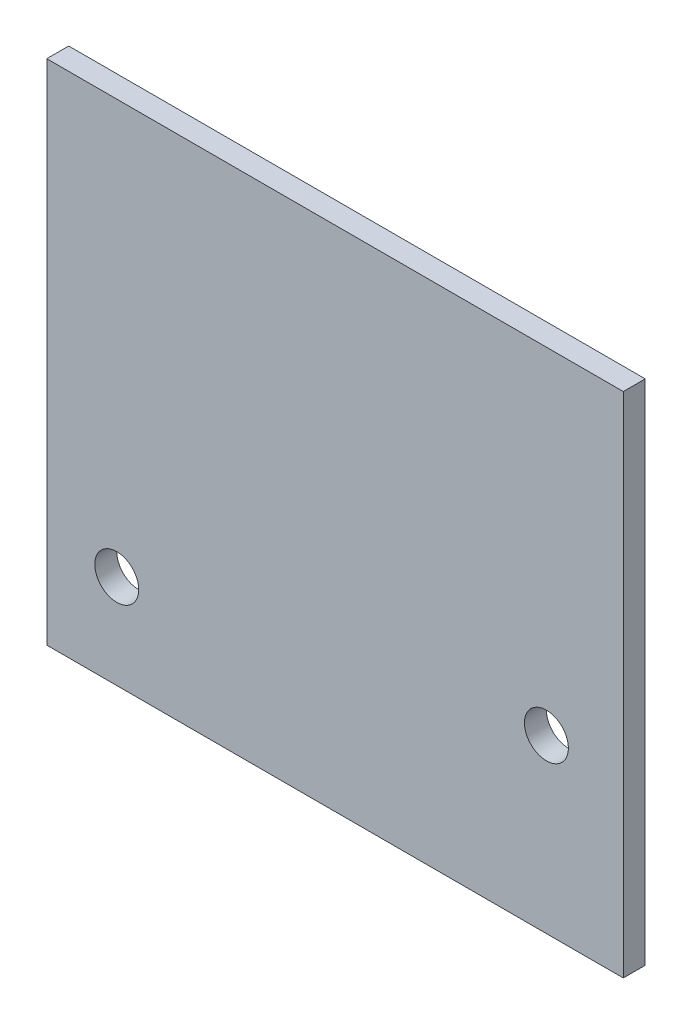
ISO-10303-21;
HEADER;
FILE_DESCRIPTION(('STEP AP214'),'2;1');
FILE_NAME('part.step','',(''),(''),'','','');
FILE_SCHEMA(('AUTOMOTIVE_DESIGN { 1 0 10303 214 1 1 1 1 }'));
ENDSEC;
DATA;
#1=APPLICATION_CONTEXT('core data for automotive mechanical design processes');
#2=APPLICATION_PROTOCOL_DEFINITION('international standard','automotive_design',2000,#1);
#3=PRODUCT_CONTEXT('',#1,'mechanical');
#4=PRODUCT('Part','Part','',(#3));
#5=PRODUCT_RELATED_PRODUCT_CATEGORY('part','',(#4));
#6=PRODUCT_DEFINITION_FORMATION('','',#4);
#7=PRODUCT_DEFINITION_CONTEXT('part definition',#1,'design');
#8=PRODUCT_DEFINITION('design','',#6,#7);
#9=PRODUCT_DEFINITION_SHAPE('','',#8);
#10=(LENGTH_UNIT() NAMED_UNIT(*) SI_UNIT(.MILLI.,.METRE.));
#11=(NAMED_UNIT(*) PLANE_ANGLE_UNIT() SI_UNIT($,.RADIAN.));
#12=(NAMED_UNIT(*) SI_UNIT($,.STERADIAN.) SOLID_ANGLE_UNIT());
#13=UNCERTAINTY_MEASURE_WITH_UNIT(LENGTH_MEASURE(1.E-05),#10,'distance_accuracy_value','');
#14=(GEOMETRIC_REPRESENTATION_CONTEXT(3) GLOBAL_UNCERTAINTY_ASSIGNED_CONTEXT((#13)) GLOBAL_UNIT_ASSIGNED_CONTEXT((#10,
#11,#12)) REPRESENTATION_CONTEXT('',''));
#15=CARTESIAN_POINT('',(0.,0.,0.));
#16=DIRECTION('',(0.,0.,1.));
#17=DIRECTION('',(1.,0.,0.));
#18=AXIS2_PLACEMENT_3D('',#15,#16,#17);
#19=CARTESIAN_POINT('',(0.,0.,1.6));
#20=DIRECTION('',(0.,0.,1.));
#21=DIRECTION('',(1.,0.,0.));
#22=AXIS2_PLACEMENT_3D('',#19,#20,#21);
#23=PLANE('',#22);
#24=CARTESIAN_POINT('',(15.4,-6.,1.6));
#25=DIRECTION('',(0.,0.,-1.));
#26=DIRECTION('',(-1.,0.,0.));
#27=AXIS2_PLACEMENT_3D('',#24,#25,#26);
#28=CIRCLE('',#27,1.6);
#29=CARTESIAN_POINT('',(13.8,-6.,1.6));
#30=VERTEX_POINT('',#29);
#31=EDGE_CURVE('E86',#30,#30,#28,.T.);
#32=ORIENTED_EDGE('',*,*,#31,.T.);
#33=EDGE_LOOP('',(#32));
#34=FACE_BOUND('',#33,.T.);
#35=CARTESIAN_POINT('',(-15.9,-11.65,1.6));
#36=DIRECTION('',(0.,0.,-1.));
#37=DIRECTION('',(-1.,0.,0.));
#38=AXIS2_PLACEMENT_3D('',#35,#36,#37);
#39=CIRCLE('',#38,1.60000000000001);
#40=CARTESIAN_POINT('',(-17.5,-11.65,1.6));
#41=VERTEX_POINT('',#40);
#42=EDGE_CURVE('E21',#41,#41,#39,.T.);
#43=ORIENTED_EDGE('',*,*,#42,.T.);
#44=EDGE_LOOP('',(#43));
#45=FACE_BOUND('',#44,.T.);
#46=DIRECTION('',(0.,1.,0.));
#47=VECTOR('',#46,1.);
#48=CARTESIAN_POINT('',(-21.,-18.5,1.6));
#49=LINE('',#48,#47);
#50=CARTESIAN_POINT('',(-21.,-18.5,1.6));
#51=VERTEX_POINT('',#50);
#52=CARTESIAN_POINT('',(-21.,18.5,1.6));
#53=VERTEX_POINT('',#52);
#54=EDGE_CURVE('E69',#51,#53,#49,.T.);
#55=ORIENTED_EDGE('',*,*,#54,.F.);
#56=DIRECTION('',(1.,0.,0.));
#57=VECTOR('',#56,1.);
#58=CARTESIAN_POINT('',(21.,-18.5,1.6));
#59=LINE('',#58,#57);
#60=CARTESIAN_POINT('',(21.,-18.5,1.6));
#61=VERTEX_POINT('',#60);
#62=EDGE_CURVE('E60',#61,#51,#59,.F.);
#63=ORIENTED_EDGE('',*,*,#62,.F.);
#64=DIRECTION('',(0.,1.,0.));
#65=VECTOR('',#64,1.);
#66=CARTESIAN_POINT('',(21.,18.5,1.6));
#67=LINE('',#66,#65);
#68=CARTESIAN_POINT('',(21.,18.5,1.6));
#69=VERTEX_POINT('',#68);
#70=EDGE_CURVE('E55',#69,#61,#67,.F.);
#71=ORIENTED_EDGE('',*,*,#70,.F.);
#72=DIRECTION('',(1.,0.,0.));
#73=VECTOR('',#72,1.);
#74=CARTESIAN_POINT('',(-21.,18.5,1.6));
#75=LINE('',#74,#73);
#76=EDGE_CURVE('E72',#53,#69,#75,.T.);
#77=ORIENTED_EDGE('',*,*,#76,.F.);
#78=EDGE_LOOP('',(#55,#63,#71,#77));
#79=FACE_BOUND('',#78,.T.);
#80=ADVANCED_FACE('F17',(#34,#45,#79),#23,.T.);
#81=CARTESIAN_POINT('',(-21.,-18.5,0.));
#82=DIRECTION('',(-1.,0.,0.));
#83=DIRECTION('',(0.,0.,1.));
#84=AXIS2_PLACEMENT_3D('',#81,#82,#83);
#85=PLANE('',#84);
#86=DIRECTION('',(0.,1.,0.));
#87=VECTOR('',#86,1.);
#88=CARTESIAN_POINT('',(-21.,0.,0.));
#89=LINE('',#88,#87);
#90=CARTESIAN_POINT('',(-21.,18.5,0.));
#91=VERTEX_POINT('',#90);
#92=CARTESIAN_POINT('',(-21.,-18.5,0.));
#93=VERTEX_POINT('',#92);
#94=EDGE_CURVE('E79',#91,#93,#89,.F.);
#95=ORIENTED_EDGE('',*,*,#94,.T.);
#96=DIRECTION('',(0.,0.,-1.));
#97=VECTOR('',#96,1.);
#98=CARTESIAN_POINT('',(-21.,-18.5,0.));
#99=LINE('',#98,#97);
#100=EDGE_CURVE('E65',#51,#93,#99,.T.);
#101=ORIENTED_EDGE('',*,*,#100,.F.);
#102=ORIENTED_EDGE('',*,*,#54,.T.);
#103=DIRECTION('',(0.,0.,1.));
#104=VECTOR('',#103,1.);
#105=CARTESIAN_POINT('',(-21.,18.5,0.));
#106=LINE('',#105,#104);
#107=EDGE_CURVE('E93',#91,#53,#106,.T.);
#108=ORIENTED_EDGE('',*,*,#107,.F.);
#109=EDGE_LOOP('',(#95,#101,#102,#108));
#110=FACE_BOUND('',#109,.T.);
#111=ADVANCED_FACE('F78',(#110),#85,.T.);
#112=CARTESIAN_POINT('',(21.,-18.5,0.));
#113=DIRECTION('',(0.,-1.,0.));
#114=DIRECTION('',(0.,0.,-1.));
#115=AXIS2_PLACEMENT_3D('',#112,#113,#114);
#116=PLANE('',#115);
#117=DIRECTION('',(1.,0.,0.));
#118=VECTOR('',#117,1.);
#119=CARTESIAN_POINT('',(0.,-18.5,0.));
#120=LINE('',#119,#118);
#121=CARTESIAN_POINT('',(21.,-18.5,0.));
#122=VERTEX_POINT('',#121);
#123=EDGE_CURVE('E90',#93,#122,#120,.T.);
#124=ORIENTED_EDGE('',*,*,#123,.T.);
#125=DIRECTION('',(0.,0.,-1.));
#126=VECTOR('',#125,1.);
#127=CARTESIAN_POINT('',(21.,-18.5,0.));
#128=LINE('',#127,#126);
#129=EDGE_CURVE('E67',#61,#122,#128,.T.);
#130=ORIENTED_EDGE('',*,*,#129,.F.);
#131=ORIENTED_EDGE('',*,*,#62,.T.);
#132=ORIENTED_EDGE('',*,*,#100,.T.);
#133=EDGE_LOOP('',(#124,#130,#131,#132));
#134=FACE_BOUND('',#133,.T.);
#135=ADVANCED_FACE('F63',(#134),#116,.T.);
#136=CARTESIAN_POINT('',(21.,18.5,0.));
#137=DIRECTION('',(1.,0.,0.));
#138=DIRECTION('',(0.,0.,-1.));
#139=AXIS2_PLACEMENT_3D('',#136,#137,#138);
#140=PLANE('',#139);
#141=DIRECTION('',(0.,1.,0.));
#142=VECTOR('',#141,1.);
#143=CARTESIAN_POINT('',(21.,0.,0.));
#144=LINE('',#143,#142);
#145=CARTESIAN_POINT('',(21.,18.5,0.));
#146=VERTEX_POINT('',#145);
#147=EDGE_CURVE('E103',#122,#146,#144,.T.);
#148=ORIENTED_EDGE('',*,*,#147,.T.);
#149=DIRECTION('',(0.,0.,1.));
#150=VECTOR('',#149,1.);
#151=CARTESIAN_POINT('',(21.,18.5,0.));
#152=LINE('',#151,#150);
#153=EDGE_CURVE('E36',#69,#146,#152,.F.);
#154=ORIENTED_EDGE('',*,*,#153,.F.);
#155=ORIENTED_EDGE('',*,*,#70,.T.);
#156=ORIENTED_EDGE('',*,*,#129,.T.);
#157=EDGE_LOOP('',(#148,#154,#155,#156));
#158=FACE_BOUND('',#157,.T.);
#159=ADVANCED_FACE('F102',(#158),#140,.T.);
#160=CARTESIAN_POINT('',(-21.,18.5,0.));
#161=DIRECTION('',(0.,1.,0.));
#162=DIRECTION('',(0.,0.,1.));
#163=AXIS2_PLACEMENT_3D('',#160,#161,#162);
#164=PLANE('',#163);
#165=DIRECTION('',(1.,0.,0.));
#166=VECTOR('',#165,1.);
#167=CARTESIAN_POINT('',(0.,18.5,0.));
#168=LINE('',#167,#166);
#169=EDGE_CURVE('E85',#146,#91,#168,.F.);
#170=ORIENTED_EDGE('',*,*,#169,.T.);
#171=ORIENTED_EDGE('',*,*,#107,.T.);
#172=ORIENTED_EDGE('',*,*,#76,.T.);
#173=ORIENTED_EDGE('',*,*,#153,.T.);
#174=EDGE_LOOP('',(#170,#171,#172,#173));
#175=FACE_BOUND('',#174,.T.);
#176=ADVANCED_FACE('F108',(#175),#164,.T.);
#177=CARTESIAN_POINT('',(-15.9,-11.65,1.59999999999999));
#178=DIRECTION('',(0.,0.,-1.));
#179=DIRECTION('',(-1.,0.,0.));
#180=AXIS2_PLACEMENT_3D('',#177,#178,#179);
#181=CYLINDRICAL_SURFACE('',#180,1.60000000000001);
#182=CARTESIAN_POINT('',(-15.9,-11.65,0.));
#183=DIRECTION('',(0.,0.,-1.));
#184=DIRECTION('',(-1.,0.,0.));
#185=AXIS2_PLACEMENT_3D('',#182,#183,#184);
#186=CIRCLE('',#185,1.60000000000001);
#187=CARTESIAN_POINT('',(-17.5,-11.65,0.));
#188=VERTEX_POINT('',#187);
#189=EDGE_CURVE('E27',#188,#188,#186,.T.);
#190=ORIENTED_EDGE('',*,*,#189,.T.);
#191=EDGE_LOOP('',(#190));
#192=FACE_BOUND('',#191,.T.);
#193=ORIENTED_EDGE('',*,*,#42,.F.);
#194=EDGE_LOOP('',(#193));
#195=FACE_BOUND('',#194,.T.);
#196=ADVANCED_FACE('F110',(#192,#195),#181,.F.);
#197=CARTESIAN_POINT('',(15.4,-6.,1.59999999999999));
#198=DIRECTION('',(0.,0.,-1.));
#199=DIRECTION('',(-1.,0.,0.));
#200=AXIS2_PLACEMENT_3D('',#197,#198,#199);
#201=CYLINDRICAL_SURFACE('',#200,1.6);
#202=CARTESIAN_POINT('',(15.4,-6.,0.));
#203=DIRECTION('',(0.,0.,-1.));
#204=DIRECTION('',(-1.,0.,0.));
#205=AXIS2_PLACEMENT_3D('',#202,#203,#204);
#206=CIRCLE('',#205,1.6);
#207=CARTESIAN_POINT('',(13.8,-6.,0.));
#208=VERTEX_POINT('',#207);
#209=EDGE_CURVE('E11',#208,#208,#206,.T.);
#210=ORIENTED_EDGE('',*,*,#209,.T.);
#211=EDGE_LOOP('',(#210));
#212=FACE_BOUND('',#211,.T.);
#213=ORIENTED_EDGE('',*,*,#31,.F.);
#214=EDGE_LOOP('',(#213));
#215=FACE_BOUND('',#214,.T.);
#216=ADVANCED_FACE('F19',(#212,#215),#201,.F.);
#217=CARTESIAN_POINT('',(0.,0.,0.));
#218=DIRECTION('',(0.,0.,1.));
#219=DIRECTION('',(1.,0.,0.));
#220=AXIS2_PLACEMENT_3D('',#217,#218,#219);
#221=PLANE('',#220);
#222=ORIENTED_EDGE('',*,*,#209,.F.);
#223=EDGE_LOOP('',(#222));
#224=FACE_BOUND('',#223,.T.);
#225=ORIENTED_EDGE('',*,*,#189,.F.);
#226=EDGE_LOOP('',(#225));
#227=FACE_BOUND('',#226,.T.);
#228=ORIENTED_EDGE('',*,*,#147,.F.);
#229=ORIENTED_EDGE('',*,*,#123,.F.);
#230=ORIENTED_EDGE('',*,*,#94,.F.);
#231=ORIENTED_EDGE('',*,*,#169,.F.);
#232=EDGE_LOOP('',(#228,#229,#230,#231));
#233=FACE_BOUND('',#232,.T.);
#234=ADVANCED_FACE('F105',(#224,#227,#233),#221,.F.);
#235=CLOSED_SHELL('',(#80,#111,#135,#159,#176,#196,#216,#234));
#236=MANIFOLD_SOLID_BREP('B1',#235);
#237=ADVANCED_BREP_SHAPE_REPRESENTATION('',(#18,#236),#14);
#238=SHAPE_DEFINITION_REPRESENTATION(#9,#237);
ENDSEC;
END-ISO-10303-21;
